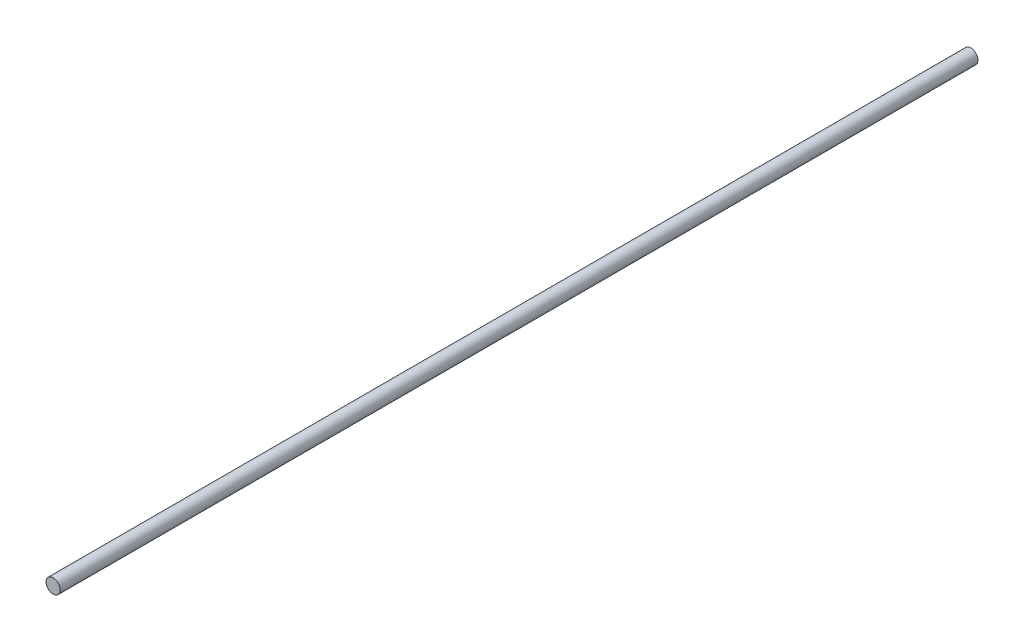
ISO-10303-21;
HEADER;
FILE_DESCRIPTION(('STEP AP214'),'2;1');
FILE_NAME('part.step','',(''),(''),'','','');
FILE_SCHEMA(('AUTOMOTIVE_DESIGN { 1 0 10303 214 1 1 1 1 }'));
ENDSEC;
DATA;
#1=APPLICATION_CONTEXT('core data for automotive mechanical design processes');
#2=APPLICATION_PROTOCOL_DEFINITION('international standard','automotive_design',2000,#1);
#3=PRODUCT_CONTEXT('',#1,'mechanical');
#4=PRODUCT('Part','Part','',(#3));
#5=PRODUCT_RELATED_PRODUCT_CATEGORY('part','',(#4));
#6=PRODUCT_DEFINITION_FORMATION('','',#4);
#7=PRODUCT_DEFINITION_CONTEXT('part definition',#1,'design');
#8=PRODUCT_DEFINITION('design','',#6,#7);
#9=PRODUCT_DEFINITION_SHAPE('','',#8);
#10=(LENGTH_UNIT() NAMED_UNIT(*) SI_UNIT(.MILLI.,.METRE.));
#11=(NAMED_UNIT(*) PLANE_ANGLE_UNIT() SI_UNIT($,.RADIAN.));
#12=(NAMED_UNIT(*) SI_UNIT($,.STERADIAN.) SOLID_ANGLE_UNIT());
#13=UNCERTAINTY_MEASURE_WITH_UNIT(LENGTH_MEASURE(1.E-05),#10,'distance_accuracy_value','');
#14=(GEOMETRIC_REPRESENTATION_CONTEXT(3) GLOBAL_UNCERTAINTY_ASSIGNED_CONTEXT((#13)) GLOBAL_UNIT_ASSIGNED_CONTEXT((#10,
#11,#12)) REPRESENTATION_CONTEXT('',''));
#15=CARTESIAN_POINT('',(0.,0.,0.));
#16=DIRECTION('',(0.,0.,1.));
#17=DIRECTION('',(1.,0.,0.));
#18=AXIS2_PLACEMENT_3D('',#15,#16,#17);
#19=CARTESIAN_POINT('',(0.,0.,-152.4));
#20=DIRECTION('',(0.,0.,1.));
#21=DIRECTION('',(1.,0.,0.));
#22=AXIS2_PLACEMENT_3D('',#19,#20,#21);
#23=CYLINDRICAL_SURFACE('',#22,1.1811);
#24=CARTESIAN_POINT('',(0.,0.,-152.4));
#25=DIRECTION('',(0.,0.,1.));
#26=DIRECTION('',(1.,0.,0.));
#27=AXIS2_PLACEMENT_3D('',#24,#25,#26);
#28=CIRCLE('',#27,1.1811);
#29=CARTESIAN_POINT('',(1.1811,0.,-152.4));
#30=VERTEX_POINT('',#29);
#31=EDGE_CURVE('E10',#30,#30,#28,.T.);
#32=CARTESIAN_POINT('',(0.,0.,0.));
#33=DIRECTION('',(0.,0.,1.));
#34=DIRECTION('',(1.,0.,0.));
#35=AXIS2_PLACEMENT_3D('',#32,#33,#34);
#36=CIRCLE('',#35,1.1811);
#37=CARTESIAN_POINT('',(1.1811,0.,0.));
#38=VERTEX_POINT('',#37);
#39=EDGE_CURVE('E34',#38,#38,#36,.T.);
#40=CARTESIAN_POINT('',(1.1811,0.,-152.4));
#41=CARTESIAN_POINT('',(1.1811,0.,-150.8125));
#42=CARTESIAN_POINT('',(1.1811,0.,-149.225));
#43=CARTESIAN_POINT('',(1.1811,0.,-146.05));
#44=CARTESIAN_POINT('',(1.1811,0.,-144.4625));
#45=CARTESIAN_POINT('',(1.1811,0.,-141.2875));
#46=CARTESIAN_POINT('',(1.1811,0.,-139.7));
#47=CARTESIAN_POINT('',(1.1811,0.,-136.525));
#48=CARTESIAN_POINT('',(1.1811,0.,-134.9375));
#49=CARTESIAN_POINT('',(1.1811,0.,-131.7625));
#50=CARTESIAN_POINT('',(1.1811,0.,-130.175));
#51=CARTESIAN_POINT('',(1.1811,0.,-127.));
#52=CARTESIAN_POINT('',(1.1811,0.,-125.4125));
#53=CARTESIAN_POINT('',(1.1811,0.,-122.2375));
#54=CARTESIAN_POINT('',(1.1811,0.,-120.65));
#55=CARTESIAN_POINT('',(1.1811,0.,-117.475));
#56=CARTESIAN_POINT('',(1.1811,0.,-115.8875));
#57=CARTESIAN_POINT('',(1.1811,0.,-112.7125));
#58=CARTESIAN_POINT('',(1.1811,0.,-111.125));
#59=CARTESIAN_POINT('',(1.1811,0.,-107.95));
#60=CARTESIAN_POINT('',(1.1811,0.,-106.3625));
#61=CARTESIAN_POINT('',(1.1811,0.,-103.1875));
#62=CARTESIAN_POINT('',(1.1811,0.,-101.6));
#63=CARTESIAN_POINT('',(1.1811,0.,-98.425));
#64=CARTESIAN_POINT('',(1.1811,0.,-96.8375));
#65=CARTESIAN_POINT('',(1.1811,0.,-93.6625));
#66=CARTESIAN_POINT('',(1.1811,0.,-92.075));
#67=CARTESIAN_POINT('',(1.1811,0.,-88.9));
#68=CARTESIAN_POINT('',(1.1811,0.,-87.3125));
#69=CARTESIAN_POINT('',(1.1811,0.,-84.1375));
#70=CARTESIAN_POINT('',(1.1811,0.,-82.55));
#71=CARTESIAN_POINT('',(1.1811,0.,-79.375));
#72=CARTESIAN_POINT('',(1.1811,0.,-77.7875));
#73=CARTESIAN_POINT('',(1.1811,0.,-74.6125));
#74=CARTESIAN_POINT('',(1.1811,0.,-73.025));
#75=CARTESIAN_POINT('',(1.1811,0.,-69.85));
#76=CARTESIAN_POINT('',(1.1811,0.,-68.2625));
#77=CARTESIAN_POINT('',(1.1811,0.,-65.0875));
#78=CARTESIAN_POINT('',(1.1811,0.,-63.5));
#79=CARTESIAN_POINT('',(1.1811,0.,-60.325));
#80=CARTESIAN_POINT('',(1.1811,0.,-58.7375));
#81=CARTESIAN_POINT('',(1.1811,0.,-55.5625));
#82=CARTESIAN_POINT('',(1.1811,0.,-53.975));
#83=CARTESIAN_POINT('',(1.1811,0.,-50.8));
#84=CARTESIAN_POINT('',(1.1811,0.,-49.2125));
#85=CARTESIAN_POINT('',(1.1811,0.,-46.0375));
#86=CARTESIAN_POINT('',(1.1811,0.,-44.45));
#87=CARTESIAN_POINT('',(1.1811,0.,-41.275));
#88=CARTESIAN_POINT('',(1.1811,0.,-39.6875));
#89=CARTESIAN_POINT('',(1.1811,0.,-36.5125));
#90=CARTESIAN_POINT('',(1.1811,0.,-34.925));
#91=CARTESIAN_POINT('',(1.1811,0.,-31.75));
#92=CARTESIAN_POINT('',(1.1811,0.,-30.1625));
#93=CARTESIAN_POINT('',(1.1811,0.,-26.9875));
#94=CARTESIAN_POINT('',(1.1811,0.,-25.4));
#95=CARTESIAN_POINT('',(1.1811,0.,-22.225));
#96=CARTESIAN_POINT('',(1.1811,0.,-20.6375));
#97=CARTESIAN_POINT('',(1.1811,0.,-17.4625));
#98=CARTESIAN_POINT('',(1.1811,0.,-15.875));
#99=CARTESIAN_POINT('',(1.1811,0.,-12.7));
#100=CARTESIAN_POINT('',(1.1811,0.,-11.1125));
#101=CARTESIAN_POINT('',(1.1811,0.,-7.93750000000001));
#102=CARTESIAN_POINT('',(1.1811,0.,-6.35));
#103=CARTESIAN_POINT('',(1.1811,0.,-3.175));
#104=CARTESIAN_POINT('',(1.1811,0.,-1.5875));
#105=CARTESIAN_POINT('',(1.1811,0.,0.));
#106=B_SPLINE_CURVE_WITH_KNOTS('',3,(#40,#41,#42,#43,#44,#45,#46,#47,#48,#49,#50,#51,#52,#53,
#54,#55,#56,#57,#58,#59,#60,#61,#62,#63,#64,#65,#66,#67,#68,#69,#70,#71,#72,#73,#74,#75,#76,#77,
#78,#79,#80,#81,#82,#83,#84,#85,#86,#87,#88,#89,#90,#91,#92,#93,#94,#95,#96,#97,#98,#99,#100,
#101,#102,#103,#104,#105),.UNSPECIFIED.,.F.,.F.,(4,2,2,2,2,2,2,2,2,2,2,2,2,2,2,2,2,2,2,2,2,2,2,
2,2,2,2,2,2,2,2,2,4),(0.,4.76249999999998,9.52499999999998,14.2875,19.05,23.8125,28.575,33.3375,
38.1,42.8625,47.625,52.3875,57.15,61.9125,66.675,71.4375,76.2,80.9625,85.725,90.4875,95.25,
100.0125,104.775,109.5375,114.3,119.0625,123.825,128.5875,133.35,138.1125,142.875,147.6375,
152.4),.UNSPECIFIED.);
#107=EDGE_CURVE('BSEAM31',#30,#38,#106,.T.);
#108=ORIENTED_EDGE('',*,*,#31,.T.);
#109=ORIENTED_EDGE('',*,*,#39,.F.);
#110=ORIENTED_EDGE('',*,*,#107,.T.);
#111=ORIENTED_EDGE('',*,*,#107,.F.);
#112=EDGE_LOOP('',(#108,#110,#109,#111));
#113=FACE_BOUND('',#112,.T.);
#114=ADVANCED_FACE('F31',(#113),#23,.T.);
#115=CARTESIAN_POINT('',(0.,0.,-152.4));
#116=DIRECTION('',(0.,0.,1.));
#117=DIRECTION('',(1.,0.,0.));
#118=AXIS2_PLACEMENT_3D('',#115,#116,#117);
#119=PLANE('',#118);
#120=ORIENTED_EDGE('',*,*,#31,.F.);
#121=EDGE_LOOP('',(#120));
#122=FACE_BOUND('',#121,.T.);
#123=ADVANCED_FACE('F46',(#122),#119,.F.);
#124=CARTESIAN_POINT('',(0.,0.,0.));
#125=DIRECTION('',(0.,0.,1.));
#126=DIRECTION('',(1.,0.,0.));
#127=AXIS2_PLACEMENT_3D('',#124,#125,#126);
#128=PLANE('',#127);
#129=ORIENTED_EDGE('',*,*,#39,.T.);
#130=EDGE_LOOP('',(#129));
#131=FACE_BOUND('',#130,.T.);
#132=ADVANCED_FACE('F43',(#131),#128,.T.);
#133=CLOSED_SHELL('',(#114,#123,#132));
#134=MANIFOLD_SOLID_BREP('B2',#133);
#135=ADVANCED_BREP_SHAPE_REPRESENTATION('',(#18,#134),#14);
#136=SHAPE_DEFINITION_REPRESENTATION(#9,#135);
ENDSEC;
END-ISO-10303-21;
